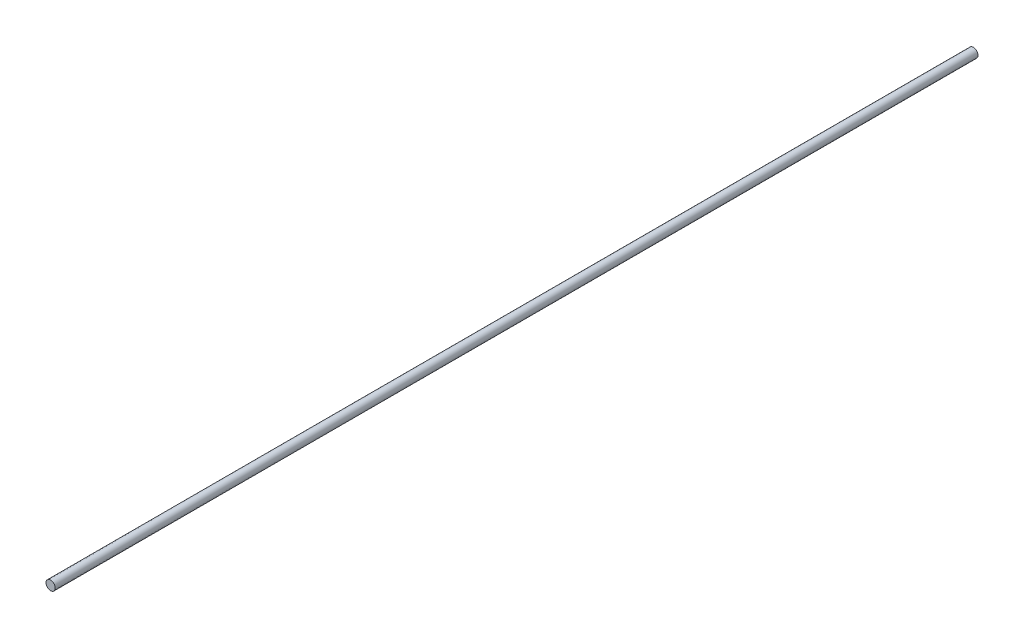
ISO-10303-21;
HEADER;
FILE_DESCRIPTION(('STEP AP214'),'2;1');
FILE_NAME('part.step','',(''),(''),'','','');
FILE_SCHEMA(('AUTOMOTIVE_DESIGN { 1 0 10303 214 1 1 1 1 }'));
ENDSEC;
DATA;
#1=APPLICATION_CONTEXT('core data for automotive mechanical design processes');
#2=APPLICATION_PROTOCOL_DEFINITION('international standard','automotive_design',2000,#1);
#3=PRODUCT_CONTEXT('',#1,'mechanical');
#4=PRODUCT('Part','Part','',(#3));
#5=PRODUCT_RELATED_PRODUCT_CATEGORY('part','',(#4));
#6=PRODUCT_DEFINITION_FORMATION('','',#4);
#7=PRODUCT_DEFINITION_CONTEXT('part definition',#1,'design');
#8=PRODUCT_DEFINITION('design','',#6,#7);
#9=PRODUCT_DEFINITION_SHAPE('','',#8);
#10=(LENGTH_UNIT() NAMED_UNIT(*) SI_UNIT(.MILLI.,.METRE.));
#11=(NAMED_UNIT(*) PLANE_ANGLE_UNIT() SI_UNIT($,.RADIAN.));
#12=(NAMED_UNIT(*) SI_UNIT($,.STERADIAN.) SOLID_ANGLE_UNIT());
#13=UNCERTAINTY_MEASURE_WITH_UNIT(LENGTH_MEASURE(1.E-05),#10,'distance_accuracy_value','');
#14=(GEOMETRIC_REPRESENTATION_CONTEXT(3) GLOBAL_UNCERTAINTY_ASSIGNED_CONTEXT((#13)) GLOBAL_UNIT_ASSIGNED_CONTEXT((#10,
#11,#12)) REPRESENTATION_CONTEXT('',''));
#15=CARTESIAN_POINT('',(0.,0.,0.));
#16=DIRECTION('',(0.,0.,1.));
#17=DIRECTION('',(1.,0.,0.));
#18=AXIS2_PLACEMENT_3D('',#15,#16,#17);
#19=CARTESIAN_POINT('',(0.,0.,100.));
#20=DIRECTION('',(0.,0.,-1.));
#21=DIRECTION('',(-1.,0.,0.));
#22=AXIS2_PLACEMENT_3D('',#19,#20,#21);
#23=CYLINDRICAL_SURFACE('',#22,0.5);
#24=CARTESIAN_POINT('',(0.,0.,100.));
#25=DIRECTION('',(0.,0.,1.));
#26=DIRECTION('',(1.,0.,0.));
#27=AXIS2_PLACEMENT_3D('',#24,#25,#26);
#28=CIRCLE('',#27,0.5);
#29=CARTESIAN_POINT('',(0.5,0.,100.));
#30=VERTEX_POINT('',#29);
#31=EDGE_CURVE('E10',#30,#30,#28,.T.);
#32=ORIENTED_EDGE('',*,*,#31,.F.);
#33=EDGE_LOOP('',(#32));
#34=FACE_BOUND('',#33,.T.);
#35=CARTESIAN_POINT('',(0.,0.,0.));
#36=DIRECTION('',(0.,0.,1.));
#37=DIRECTION('',(1.,0.,0.));
#38=AXIS2_PLACEMENT_3D('',#35,#36,#37);
#39=CIRCLE('',#38,0.5);
#40=CARTESIAN_POINT('',(0.5,0.,0.));
#41=VERTEX_POINT('',#40);
#42=EDGE_CURVE('E34',#41,#41,#39,.T.);
#43=ORIENTED_EDGE('',*,*,#42,.T.);
#44=EDGE_LOOP('',(#43));
#45=FACE_BOUND('',#44,.T.);
#46=ADVANCED_FACE('F31',(#34,#45),#23,.T.);
#47=CARTESIAN_POINT('',(0.,0.,100.));
#48=DIRECTION('',(0.,0.,1.));
#49=DIRECTION('',(1.,0.,0.));
#50=AXIS2_PLACEMENT_3D('',#47,#48,#49);
#51=PLANE('',#50);
#52=ORIENTED_EDGE('',*,*,#31,.T.);
#53=EDGE_LOOP('',(#52));
#54=FACE_BOUND('',#53,.T.);
#55=ADVANCED_FACE('F46',(#54),#51,.T.);
#56=CARTESIAN_POINT('',(0.,0.,0.));
#57=DIRECTION('',(0.,0.,1.));
#58=DIRECTION('',(1.,0.,0.));
#59=AXIS2_PLACEMENT_3D('',#56,#57,#58);
#60=PLANE('',#59);
#61=ORIENTED_EDGE('',*,*,#42,.F.);
#62=EDGE_LOOP('',(#61));
#63=FACE_BOUND('',#62,.T.);
#64=ADVANCED_FACE('F44',(#63),#60,.F.);
#65=CLOSED_SHELL('',(#46,#55,#64));
#66=MANIFOLD_SOLID_BREP('B2',#65);
#67=ADVANCED_BREP_SHAPE_REPRESENTATION('',(#18,#66),#14);
#68=SHAPE_DEFINITION_REPRESENTATION(#9,#67);
ENDSEC;
END-ISO-10303-21;
